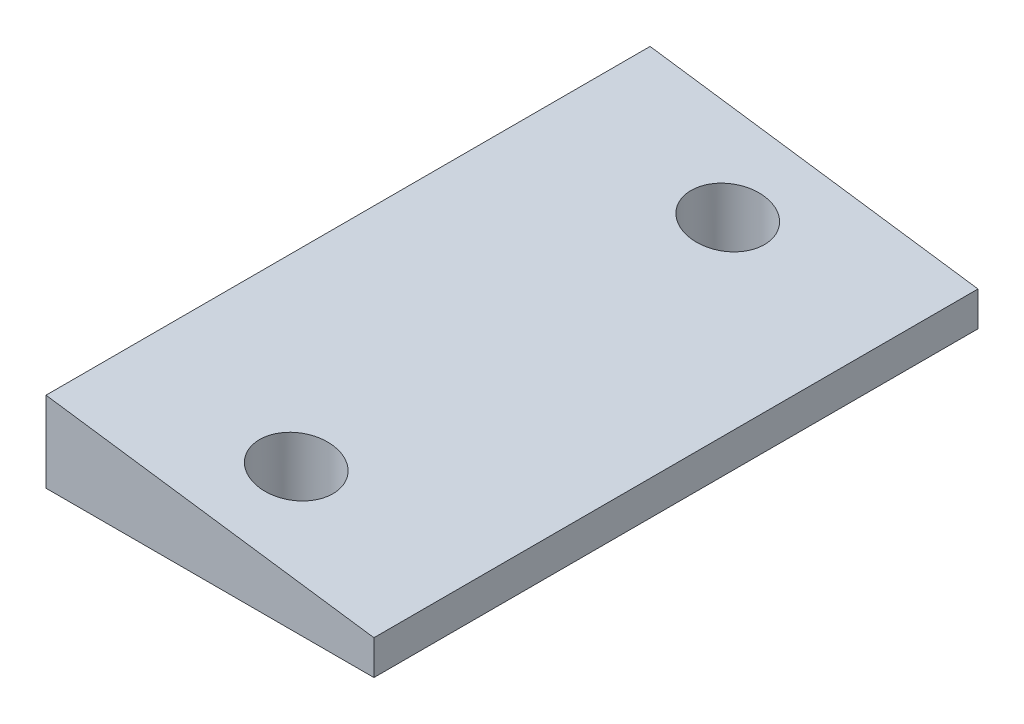
ISO-10303-21;
HEADER;
FILE_DESCRIPTION(('STEP AP214'),'2;1');
FILE_NAME('part.step','',(''),(''),'','','');
FILE_SCHEMA(('AUTOMOTIVE_DESIGN { 1 0 10303 214 1 1 1 1 }'));
ENDSEC;
DATA;
#1=APPLICATION_CONTEXT('core data for automotive mechanical design processes');
#2=APPLICATION_PROTOCOL_DEFINITION('international standard','automotive_design',2000,#1);
#3=PRODUCT_CONTEXT('',#1,'mechanical');
#4=PRODUCT('Part','Part','',(#3));
#5=PRODUCT_RELATED_PRODUCT_CATEGORY('part','',(#4));
#6=PRODUCT_DEFINITION_FORMATION('','',#4);
#7=PRODUCT_DEFINITION_CONTEXT('part definition',#1,'design');
#8=PRODUCT_DEFINITION('design','',#6,#7);
#9=PRODUCT_DEFINITION_SHAPE('','',#8);
#10=(LENGTH_UNIT() NAMED_UNIT(*) SI_UNIT(.MILLI.,.METRE.));
#11=(NAMED_UNIT(*) PLANE_ANGLE_UNIT() SI_UNIT($,.RADIAN.));
#12=(NAMED_UNIT(*) SI_UNIT($,.STERADIAN.) SOLID_ANGLE_UNIT());
#13=UNCERTAINTY_MEASURE_WITH_UNIT(LENGTH_MEASURE(1.E-05),#10,'distance_accuracy_value','');
#14=(GEOMETRIC_REPRESENTATION_CONTEXT(3) GLOBAL_UNCERTAINTY_ASSIGNED_CONTEXT((#13)) GLOBAL_UNIT_ASSIGNED_CONTEXT((#10,
#11,#12)) REPRESENTATION_CONTEXT('',''));
#15=CARTESIAN_POINT('',(0.,0.,0.));
#16=DIRECTION('',(0.,0.,1.));
#17=DIRECTION('',(1.,0.,0.));
#18=AXIS2_PLACEMENT_3D('',#15,#16,#17);
#19=CARTESIAN_POINT('',(21.4418011274785,-4.10342127464224,70.));
#20=DIRECTION('',(-1.,0.,0.));
#21=DIRECTION('',(0.,0.,1.));
#22=AXIS2_PLACEMENT_3D('',#19,#20,#21);
#23=PLANE('',#22);
#24=DIRECTION('',(0.,1.,0.));
#25=VECTOR('',#24,1.);
#26=CARTESIAN_POINT('',(21.4418011274785,-4.10342127464224,0.));
#27=LINE('',#26,#25);
#28=CARTESIAN_POINT('',(21.4418011274785,-4.10342127464224,0.));
#29=VERTEX_POINT('',#28);
#30=CARTESIAN_POINT('',(21.4418011274785,-0.103421274642241,0.));
#31=VERTEX_POINT('',#30);
#32=EDGE_CURVE('E98',#29,#31,#27,.T.);
#33=ORIENTED_EDGE('',*,*,#32,.T.);
#34=DIRECTION('',(0.,0.,-1.));
#35=VECTOR('',#34,1.);
#36=CARTESIAN_POINT('',(21.4418011274785,-0.103421274642241,70.));
#37=LINE('',#36,#35);
#38=CARTESIAN_POINT('',(21.4418011274785,-0.103421274642241,70.));
#39=VERTEX_POINT('',#38);
#40=EDGE_CURVE('E11',#39,#31,#37,.T.);
#41=ORIENTED_EDGE('',*,*,#40,.F.);
#42=DIRECTION('',(0.,1.,0.));
#43=VECTOR('',#42,1.);
#44=CARTESIAN_POINT('',(21.4418011274785,-4.10342127464224,70.));
#45=LINE('',#44,#43);
#46=CARTESIAN_POINT('',(21.4418011274785,-4.10342127464224,70.));
#47=VERTEX_POINT('',#46);
#48=EDGE_CURVE('E85',#47,#39,#45,.T.);
#49=ORIENTED_EDGE('',*,*,#48,.F.);
#50=DIRECTION('',(0.,0.,-1.));
#51=VECTOR('',#50,1.);
#52=CARTESIAN_POINT('',(21.4418011274785,-4.10342127464224,70.));
#53=LINE('',#52,#51);
#54=EDGE_CURVE('E94',#47,#29,#53,.T.);
#55=ORIENTED_EDGE('',*,*,#54,.T.);
#56=EDGE_LOOP('',(#33,#41,#49,#55));
#57=FACE_BOUND('',#56,.T.);
#58=ADVANCED_FACE('F32',(#57),#23,.F.);
#59=CARTESIAN_POINT('',(-16.5581988725215,5.23713044404864,70.));
#60=DIRECTION('',(-0.139173100960066,-0.99026806874157,0.));
#61=DIRECTION('',(0.99026806874157,-0.139173100960066,0.));
#62=AXIS2_PLACEMENT_3D('',#59,#60,#61);
#63=PLANE('',#62);
#64=CARTESIAN_POINT('',(2.4418011274785,2.5668545847032,60.));
#65=DIRECTION('',(-0.139173100960066,-0.99026806874157,0.));
#66=DIRECTION('',(-0.99026806874157,0.139173100960066,0.));
#67=AXIS2_PLACEMENT_3D('',#64,#65,#66);
#68=ELLIPSE('',#67,4.29176718320413,4.25);
#69=CARTESIAN_POINT('',(-1.8081988725215,3.16415313218836,60.));
#70=VERTEX_POINT('',#69);
#71=EDGE_CURVE('E101',#70,#70,#68,.F.);
#72=ORIENTED_EDGE('',*,*,#71,.F.);
#73=EDGE_LOOP('',(#72));
#74=FACE_BOUND('',#73,.T.);
#75=CARTESIAN_POINT('',(2.4418011274785,2.5668545847032,10.));
#76=DIRECTION('',(-0.139173100960066,-0.99026806874157,0.));
#77=DIRECTION('',(-0.99026806874157,0.139173100960066,0.));
#78=AXIS2_PLACEMENT_3D('',#75,#76,#77);
#79=ELLIPSE('',#78,4.29176718320413,4.25);
#80=CARTESIAN_POINT('',(-1.8081988725215,3.16415313218836,10.));
#81=VERTEX_POINT('',#80);
#82=EDGE_CURVE('E108',#81,#81,#79,.F.);
#83=ORIENTED_EDGE('',*,*,#82,.F.);
#84=EDGE_LOOP('',(#83));
#85=FACE_BOUND('',#84,.T.);
#86=DIRECTION('',(-0.99026806874157,0.139173100960066,0.));
#87=VECTOR('',#86,1.);
#88=CARTESIAN_POINT('',(-16.5581988725215,5.23713044404864,0.));
#89=LINE('',#88,#87);
#90=CARTESIAN_POINT('',(-16.5581988725215,5.23713044404864,0.));
#91=VERTEX_POINT('',#90);
#92=EDGE_CURVE('E89',#31,#91,#89,.T.);
#93=ORIENTED_EDGE('',*,*,#92,.T.);
#94=DIRECTION('',(0.,0.,-1.));
#95=VECTOR('',#94,1.);
#96=CARTESIAN_POINT('',(-16.5581988725215,5.23713044404864,70.));
#97=LINE('',#96,#95);
#98=CARTESIAN_POINT('',(-16.5581988725215,5.23713044404864,70.));
#99=VERTEX_POINT('',#98);
#100=EDGE_CURVE('E41',#99,#91,#97,.T.);
#101=ORIENTED_EDGE('',*,*,#100,.F.);
#102=DIRECTION('',(-0.99026806874157,0.139173100960066,0.));
#103=VECTOR('',#102,1.);
#104=CARTESIAN_POINT('',(-16.5581988725215,5.23713044404864,70.));
#105=LINE('',#104,#103);
#106=EDGE_CURVE('E80',#39,#99,#105,.T.);
#107=ORIENTED_EDGE('',*,*,#106,.F.);
#108=ORIENTED_EDGE('',*,*,#40,.T.);
#109=EDGE_LOOP('',(#93,#101,#107,#108));
#110=FACE_BOUND('',#109,.T.);
#111=ADVANCED_FACE('F88',(#74,#85,#110),#63,.F.);
#112=CARTESIAN_POINT('',(-16.5581988725215,5.23713044404864,70.));
#113=DIRECTION('',(1.,0.,0.));
#114=DIRECTION('',(0.,0.,-1.));
#115=AXIS2_PLACEMENT_3D('',#112,#113,#114);
#116=PLANE('',#115);
#117=DIRECTION('',(0.,-1.,0.));
#118=VECTOR('',#117,1.);
#119=CARTESIAN_POINT('',(-16.5581988725215,5.23713044404864,0.));
#120=LINE('',#119,#118);
#121=CARTESIAN_POINT('',(-16.5581988725215,-4.10342127464224,0.));
#122=VERTEX_POINT('',#121);
#123=EDGE_CURVE('E67',#91,#122,#120,.T.);
#124=ORIENTED_EDGE('',*,*,#123,.T.);
#125=DIRECTION('',(0.,0.,-1.));
#126=VECTOR('',#125,1.);
#127=CARTESIAN_POINT('',(-16.5581988725215,-4.10342127464224,70.));
#128=LINE('',#127,#126);
#129=CARTESIAN_POINT('',(-16.5581988725215,-4.10342127464224,70.));
#130=VERTEX_POINT('',#129);
#131=EDGE_CURVE('E90',#130,#122,#128,.T.);
#132=ORIENTED_EDGE('',*,*,#131,.F.);
#133=DIRECTION('',(0.,-1.,0.));
#134=VECTOR('',#133,1.);
#135=CARTESIAN_POINT('',(-16.5581988725215,5.23713044404864,70.));
#136=LINE('',#135,#134);
#137=EDGE_CURVE('E83',#99,#130,#136,.T.);
#138=ORIENTED_EDGE('',*,*,#137,.F.);
#139=ORIENTED_EDGE('',*,*,#100,.T.);
#140=EDGE_LOOP('',(#124,#132,#138,#139));
#141=FACE_BOUND('',#140,.T.);
#142=ADVANCED_FACE('F92',(#141),#116,.F.);
#143=CARTESIAN_POINT('',(-16.5581988725215,-4.10342127464224,70.));
#144=DIRECTION('',(0.,1.,0.));
#145=DIRECTION('',(0.,0.,1.));
#146=AXIS2_PLACEMENT_3D('',#143,#144,#145);
#147=PLANE('',#146);
#148=CARTESIAN_POINT('',(2.4418011274785,-4.10342127464224,60.));
#149=DIRECTION('',(0.,1.,0.));
#150=DIRECTION('',(0.,0.,1.));
#151=AXIS2_PLACEMENT_3D('',#148,#149,#150);
#152=CIRCLE('',#151,4.25);
#153=CARTESIAN_POINT('',(2.4418011274785,-4.10342127464224,64.25));
#154=VERTEX_POINT('',#153);
#155=EDGE_CURVE('E35',#154,#154,#152,.F.);
#156=ORIENTED_EDGE('',*,*,#155,.F.);
#157=EDGE_LOOP('',(#156));
#158=FACE_BOUND('',#157,.T.);
#159=CARTESIAN_POINT('',(2.4418011274785,-4.10342127464224,10.));
#160=DIRECTION('',(0.,1.,0.));
#161=DIRECTION('',(0.,0.,1.));
#162=AXIS2_PLACEMENT_3D('',#159,#160,#161);
#163=CIRCLE('',#162,4.25);
#164=CARTESIAN_POINT('',(2.4418011274785,-4.10342127464224,14.25));
#165=VERTEX_POINT('',#164);
#166=EDGE_CURVE('E106',#165,#165,#163,.F.);
#167=ORIENTED_EDGE('',*,*,#166,.F.);
#168=EDGE_LOOP('',(#167));
#169=FACE_BOUND('',#168,.T.);
#170=DIRECTION('',(1.,0.,0.));
#171=VECTOR('',#170,1.);
#172=CARTESIAN_POINT('',(-16.5581988725215,-4.10342127464224,0.));
#173=LINE('',#172,#171);
#174=EDGE_CURVE('E73',#122,#29,#173,.T.);
#175=ORIENTED_EDGE('',*,*,#174,.T.);
#176=ORIENTED_EDGE('',*,*,#54,.F.);
#177=DIRECTION('',(1.,0.,0.));
#178=VECTOR('',#177,1.);
#179=CARTESIAN_POINT('',(-16.5581988725215,-4.10342127464224,70.));
#180=LINE('',#179,#178);
#181=EDGE_CURVE('E50',#130,#47,#180,.T.);
#182=ORIENTED_EDGE('',*,*,#181,.F.);
#183=ORIENTED_EDGE('',*,*,#131,.T.);
#184=EDGE_LOOP('',(#175,#176,#182,#183));
#185=FACE_BOUND('',#184,.T.);
#186=ADVANCED_FACE('F128',(#158,#169,#185),#147,.F.);
#187=CARTESIAN_POINT('',(0.,0.,70.));
#188=DIRECTION('',(0.,0.,-1.));
#189=DIRECTION('',(-1.,0.,0.));
#190=AXIS2_PLACEMENT_3D('',#187,#188,#189);
#191=PLANE('',#190);
#192=ORIENTED_EDGE('',*,*,#48,.T.);
#193=ORIENTED_EDGE('',*,*,#106,.T.);
#194=ORIENTED_EDGE('',*,*,#137,.T.);
#195=ORIENTED_EDGE('',*,*,#181,.T.);
#196=EDGE_LOOP('',(#192,#193,#194,#195));
#197=FACE_BOUND('',#196,.T.);
#198=ADVANCED_FACE('F81',(#197),#191,.F.);
#199=CARTESIAN_POINT('',(0.,0.,0.));
#200=DIRECTION('',(0.,0.,-1.));
#201=DIRECTION('',(-1.,0.,0.));
#202=AXIS2_PLACEMENT_3D('',#199,#200,#201);
#203=PLANE('',#202);
#204=ORIENTED_EDGE('',*,*,#32,.F.);
#205=ORIENTED_EDGE('',*,*,#174,.F.);
#206=ORIENTED_EDGE('',*,*,#123,.F.);
#207=ORIENTED_EDGE('',*,*,#92,.F.);
#208=EDGE_LOOP('',(#204,#205,#206,#207));
#209=FACE_BOUND('',#208,.T.);
#210=ADVANCED_FACE('F135',(#209),#203,.T.);
#211=CARTESIAN_POINT('',(2.4418011274785,-4.76286955595136,10.));
#212=DIRECTION('',(0.,1.,0.));
#213=DIRECTION('',(0.,0.,1.));
#214=AXIS2_PLACEMENT_3D('',#211,#212,#213);
#215=CYLINDRICAL_SURFACE('',#214,4.25);
#216=ORIENTED_EDGE('',*,*,#166,.T.);
#217=EDGE_LOOP('',(#216));
#218=FACE_BOUND('',#217,.T.);
#219=ORIENTED_EDGE('',*,*,#82,.T.);
#220=EDGE_LOOP('',(#219));
#221=FACE_BOUND('',#220,.T.);
#222=ADVANCED_FACE('F138',(#218,#221),#215,.F.);
#223=CARTESIAN_POINT('',(2.4418011274785,-4.76286955595136,60.));
#224=DIRECTION('',(0.,1.,0.));
#225=DIRECTION('',(0.,0.,1.));
#226=AXIS2_PLACEMENT_3D('',#223,#224,#225);
#227=CYLINDRICAL_SURFACE('',#226,4.25);
#228=ORIENTED_EDGE('',*,*,#155,.T.);
#229=EDGE_LOOP('',(#228));
#230=FACE_BOUND('',#229,.T.);
#231=ORIENTED_EDGE('',*,*,#71,.T.);
#232=EDGE_LOOP('',(#231));
#233=FACE_BOUND('',#232,.T.);
#234=ADVANCED_FACE('F120',(#230,#233),#227,.F.);
#235=CLOSED_SHELL('',(#58,#111,#142,#186,#198,#210,#222,#234));
#236=MANIFOLD_SOLID_BREP('B2',#235);
#237=ADVANCED_BREP_SHAPE_REPRESENTATION('',(#18,#236),#14);
#238=SHAPE_DEFINITION_REPRESENTATION(#9,#237);
ENDSEC;
END-ISO-10303-21;
